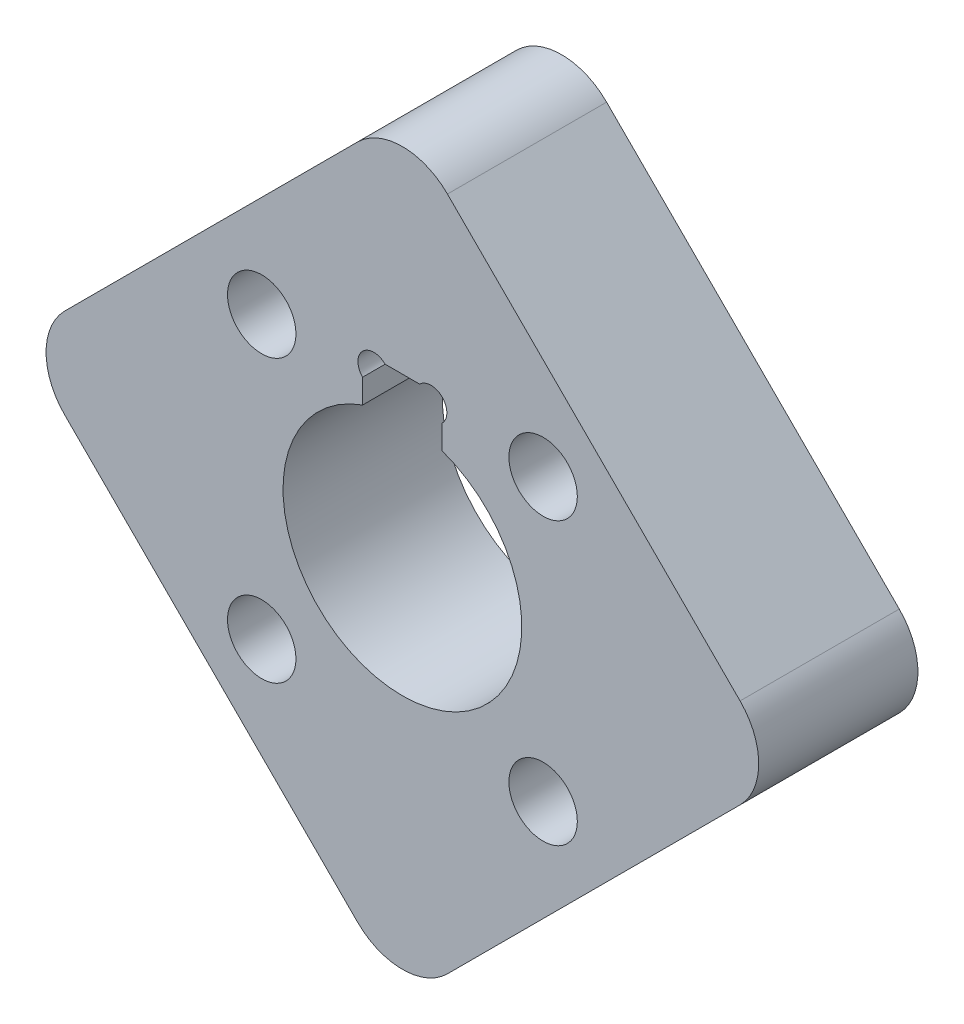
ISO-10303-21;
HEADER;
FILE_DESCRIPTION(('STEP AP214'),'2;1');
FILE_NAME('part.step','',(''),(''),'','','');
FILE_SCHEMA(('AUTOMOTIVE_DESIGN { 1 0 10303 214 1 1 1 1 }'));
ENDSEC;
DATA;
#1=APPLICATION_CONTEXT('core data for automotive mechanical design processes');
#2=APPLICATION_PROTOCOL_DEFINITION('international standard','automotive_design',2000,#1);
#3=PRODUCT_CONTEXT('',#1,'mechanical');
#4=PRODUCT('Part','Part','',(#3));
#5=PRODUCT_RELATED_PRODUCT_CATEGORY('part','',(#4));
#6=PRODUCT_DEFINITION_FORMATION('','',#4);
#7=PRODUCT_DEFINITION_CONTEXT('part definition',#1,'design');
#8=PRODUCT_DEFINITION('design','',#6,#7);
#9=PRODUCT_DEFINITION_SHAPE('','',#8);
#10=(LENGTH_UNIT() NAMED_UNIT(*) SI_UNIT(.MILLI.,.METRE.));
#11=(NAMED_UNIT(*) PLANE_ANGLE_UNIT() SI_UNIT($,.RADIAN.));
#12=(NAMED_UNIT(*) SI_UNIT($,.STERADIAN.) SOLID_ANGLE_UNIT());
#13=UNCERTAINTY_MEASURE_WITH_UNIT(LENGTH_MEASURE(1.E-05),#10,'distance_accuracy_value','');
#14=(GEOMETRIC_REPRESENTATION_CONTEXT(3) GLOBAL_UNCERTAINTY_ASSIGNED_CONTEXT((#13)) GLOBAL_UNIT_ASSIGNED_CONTEXT((#10,
#11,#12)) REPRESENTATION_CONTEXT('',''));
#15=CARTESIAN_POINT('',(0.,0.,0.));
#16=DIRECTION('',(0.,0.,1.));
#17=DIRECTION('',(1.,0.,0.));
#18=AXIS2_PLACEMENT_3D('',#15,#16,#17);
#19=CARTESIAN_POINT('',(0.,18.3847763108502,10.));
#20=DIRECTION('',(0.,0.,-1.));
#21=DIRECTION('',(-1.,0.,0.));
#22=AXIS2_PLACEMENT_3D('',#19,#20,#21);
#23=CYLINDRICAL_SURFACE('',#22,4.);
#24=CARTESIAN_POINT('',(0.,18.3847763108502,0.));
#25=DIRECTION('',(0.,0.,1.));
#26=DIRECTION('',(1.,0.,0.));
#27=AXIS2_PLACEMENT_3D('',#24,#25,#26);
#28=CIRCLE('',#27,4.);
#29=CARTESIAN_POINT('',(-2.82842712474619,21.2132034355964,0.));
#30=VERTEX_POINT('',#29);
#31=CARTESIAN_POINT('',(2.82842712474619,21.2132034355964,0.));
#32=VERTEX_POINT('',#31);
#33=EDGE_CURVE('E215',#30,#32,#28,.F.);
#34=ORIENTED_EDGE('',*,*,#33,.F.);
#35=DIRECTION('',(0.,0.,-1.));
#36=VECTOR('',#35,1.);
#37=CARTESIAN_POINT('',(-2.82842712474619,21.2132034355964,10.));
#38=LINE('',#37,#36);
#39=CARTESIAN_POINT('',(-2.82842712474619,21.2132034355964,10.));
#40=VERTEX_POINT('',#39);
#41=EDGE_CURVE('E11',#40,#30,#38,.T.);
#42=ORIENTED_EDGE('',*,*,#41,.F.);
#43=CARTESIAN_POINT('',(0.,18.3847763108502,10.));
#44=DIRECTION('',(0.,0.,1.));
#45=DIRECTION('',(1.,0.,0.));
#46=AXIS2_PLACEMENT_3D('',#43,#44,#45);
#47=CIRCLE('',#46,4.);
#48=CARTESIAN_POINT('',(2.82842712474619,21.2132034355964,10.));
#49=VERTEX_POINT('',#48);
#50=EDGE_CURVE('E244',#40,#49,#47,.F.);
#51=ORIENTED_EDGE('',*,*,#50,.T.);
#52=DIRECTION('',(0.,0.,-1.));
#53=VECTOR('',#52,1.);
#54=CARTESIAN_POINT('',(2.82842712474619,21.2132034355964,10.));
#55=LINE('',#54,#53);
#56=EDGE_CURVE('E55',#49,#32,#55,.T.);
#57=ORIENTED_EDGE('',*,*,#56,.T.);
#58=EDGE_LOOP('',(#34,#42,#51,#57));
#59=FACE_BOUND('',#58,.T.);
#60=ADVANCED_FACE('F36',(#59),#23,.T.);
#61=CARTESIAN_POINT('',(-12.0208152801713,12.0208152801713,10.));
#62=DIRECTION('',(-0.707106781186547,0.707106781186548,0.));
#63=DIRECTION('',(-0.707106781186548,-0.707106781186547,0.));
#64=AXIS2_PLACEMENT_3D('',#61,#62,#63);
#65=PLANE('',#64);
#66=DIRECTION('',(0.707106781186548,0.707106781186547,0.));
#67=VECTOR('',#66,1.);
#68=CARTESIAN_POINT('',(-12.0208152801713,12.0208152801713,0.));
#69=LINE('',#68,#67);
#70=CARTESIAN_POINT('',(-21.2132034355964,2.82842712474619,0.));
#71=VERTEX_POINT('',#70);
#72=EDGE_CURVE('E212',#71,#30,#69,.T.);
#73=ORIENTED_EDGE('',*,*,#72,.F.);
#74=DIRECTION('',(0.,0.,-1.));
#75=VECTOR('',#74,1.);
#76=CARTESIAN_POINT('',(-21.2132034355964,2.82842712474619,10.));
#77=LINE('',#76,#75);
#78=CARTESIAN_POINT('',(-21.2132034355964,2.82842712474619,10.));
#79=VERTEX_POINT('',#78);
#80=EDGE_CURVE('E46',#79,#71,#77,.T.);
#81=ORIENTED_EDGE('',*,*,#80,.F.);
#82=DIRECTION('',(0.707106781186548,0.707106781186547,0.));
#83=VECTOR('',#82,1.);
#84=CARTESIAN_POINT('',(-12.0208152801713,12.0208152801713,10.));
#85=LINE('',#84,#83);
#86=EDGE_CURVE('E241',#79,#40,#85,.T.);
#87=ORIENTED_EDGE('',*,*,#86,.T.);
#88=ORIENTED_EDGE('',*,*,#41,.T.);
#89=EDGE_LOOP('',(#73,#81,#87,#88));
#90=FACE_BOUND('',#89,.T.);
#91=ADVANCED_FACE('F324',(#90),#65,.T.);
#92=CARTESIAN_POINT('',(-18.3847763108502,0.,10.));
#93=DIRECTION('',(0.,0.,-1.));
#94=DIRECTION('',(-1.,0.,0.));
#95=AXIS2_PLACEMENT_3D('',#92,#93,#94);
#96=CYLINDRICAL_SURFACE('',#95,4.);
#97=CARTESIAN_POINT('',(-18.3847763108502,0.,0.));
#98=DIRECTION('',(0.,0.,1.));
#99=DIRECTION('',(1.,0.,0.));
#100=AXIS2_PLACEMENT_3D('',#97,#98,#99);
#101=CIRCLE('',#100,4.);
#102=CARTESIAN_POINT('',(-21.2132034355964,-2.82842712474619,0.));
#103=VERTEX_POINT('',#102);
#104=EDGE_CURVE('E209',#71,#103,#101,.T.);
#105=ORIENTED_EDGE('',*,*,#104,.T.);
#106=DIRECTION('',(0.,0.,-1.));
#107=VECTOR('',#106,1.);
#108=CARTESIAN_POINT('',(-21.2132034355964,-2.82842712474619,10.));
#109=LINE('',#108,#107);
#110=CARTESIAN_POINT('',(-21.2132034355964,-2.82842712474619,10.));
#111=VERTEX_POINT('',#110);
#112=EDGE_CURVE('E175',#111,#103,#109,.T.);
#113=ORIENTED_EDGE('',*,*,#112,.F.);
#114=CARTESIAN_POINT('',(-18.3847763108502,0.,10.));
#115=DIRECTION('',(0.,0.,1.));
#116=DIRECTION('',(1.,0.,0.));
#117=AXIS2_PLACEMENT_3D('',#114,#115,#116);
#118=CIRCLE('',#117,4.);
#119=EDGE_CURVE('E238',#79,#111,#118,.T.);
#120=ORIENTED_EDGE('',*,*,#119,.F.);
#121=ORIENTED_EDGE('',*,*,#80,.T.);
#122=EDGE_LOOP('',(#105,#113,#120,#121));
#123=FACE_BOUND('',#122,.T.);
#124=ADVANCED_FACE('F329',(#123),#96,.T.);
#125=CARTESIAN_POINT('',(-12.0208152801713,-12.0208152801713,10.));
#126=DIRECTION('',(0.707106781186547,0.707106781186548,0.));
#127=DIRECTION('',(-0.707106781186548,0.707106781186547,0.));
#128=AXIS2_PLACEMENT_3D('',#125,#126,#127);
#129=PLANE('',#128);
#130=DIRECTION('',(0.707106781186548,-0.707106781186547,0.));
#131=VECTOR('',#130,1.);
#132=CARTESIAN_POINT('',(-12.0208152801713,-12.0208152801713,0.));
#133=LINE('',#132,#131);
#134=CARTESIAN_POINT('',(-2.82842712474619,-21.2132034355964,0.));
#135=VERTEX_POINT('',#134);
#136=EDGE_CURVE('E206',#103,#135,#133,.T.);
#137=ORIENTED_EDGE('',*,*,#136,.T.);
#138=DIRECTION('',(0.,0.,-1.));
#139=VECTOR('',#138,1.);
#140=CARTESIAN_POINT('',(-2.82842712474619,-21.2132034355964,10.));
#141=LINE('',#140,#139);
#142=CARTESIAN_POINT('',(-2.82842712474619,-21.2132034355964,10.));
#143=VERTEX_POINT('',#142);
#144=EDGE_CURVE('E168',#143,#135,#141,.T.);
#145=ORIENTED_EDGE('',*,*,#144,.F.);
#146=DIRECTION('',(0.707106781186548,-0.707106781186547,0.));
#147=VECTOR('',#146,1.);
#148=CARTESIAN_POINT('',(-12.0208152801713,-12.0208152801713,10.));
#149=LINE('',#148,#147);
#150=EDGE_CURVE('E236',#111,#143,#149,.T.);
#151=ORIENTED_EDGE('',*,*,#150,.F.);
#152=ORIENTED_EDGE('',*,*,#112,.T.);
#153=EDGE_LOOP('',(#137,#145,#151,#152));
#154=FACE_BOUND('',#153,.T.);
#155=ADVANCED_FACE('F335',(#154),#129,.F.);
#156=CARTESIAN_POINT('',(0.,-18.3847763108502,10.));
#157=DIRECTION('',(0.,0.,-1.));
#158=DIRECTION('',(-1.,0.,0.));
#159=AXIS2_PLACEMENT_3D('',#156,#157,#158);
#160=CYLINDRICAL_SURFACE('',#159,4.);
#161=CARTESIAN_POINT('',(0.,-18.3847763108502,0.));
#162=DIRECTION('',(0.,0.,1.));
#163=DIRECTION('',(1.,0.,0.));
#164=AXIS2_PLACEMENT_3D('',#161,#162,#163);
#165=CIRCLE('',#164,4.);
#166=CARTESIAN_POINT('',(2.82842712474619,-21.2132034355964,0.));
#167=VERTEX_POINT('',#166);
#168=EDGE_CURVE('E203',#135,#167,#165,.T.);
#169=ORIENTED_EDGE('',*,*,#168,.T.);
#170=DIRECTION('',(0.,0.,-1.));
#171=VECTOR('',#170,1.);
#172=CARTESIAN_POINT('',(2.82842712474619,-21.2132034355964,10.));
#173=LINE('',#172,#171);
#174=CARTESIAN_POINT('',(2.82842712474619,-21.2132034355964,10.));
#175=VERTEX_POINT('',#174);
#176=EDGE_CURVE('E166',#175,#167,#173,.T.);
#177=ORIENTED_EDGE('',*,*,#176,.F.);
#178=CARTESIAN_POINT('',(0.,-18.3847763108502,10.));
#179=DIRECTION('',(0.,0.,1.));
#180=DIRECTION('',(1.,0.,0.));
#181=AXIS2_PLACEMENT_3D('',#178,#179,#180);
#182=CIRCLE('',#181,4.);
#183=EDGE_CURVE('E159',#143,#175,#182,.T.);
#184=ORIENTED_EDGE('',*,*,#183,.F.);
#185=ORIENTED_EDGE('',*,*,#144,.T.);
#186=EDGE_LOOP('',(#169,#177,#184,#185));
#187=FACE_BOUND('',#186,.T.);
#188=ADVANCED_FACE('F339',(#187),#160,.T.);
#189=CARTESIAN_POINT('',(12.0208152801713,-12.0208152801713,10.));
#190=DIRECTION('',(-0.707106781186547,0.707106781186548,0.));
#191=DIRECTION('',(-0.707106781186548,-0.707106781186547,0.));
#192=AXIS2_PLACEMENT_3D('',#189,#190,#191);
#193=PLANE('',#192);
#194=DIRECTION('',(0.707106781186548,0.707106781186547,0.));
#195=VECTOR('',#194,1.);
#196=CARTESIAN_POINT('',(12.0208152801713,-12.0208152801713,0.));
#197=LINE('',#196,#195);
#198=CARTESIAN_POINT('',(21.2132034355964,-2.82842712474619,0.));
#199=VERTEX_POINT('',#198);
#200=EDGE_CURVE('E165',#167,#199,#197,.T.);
#201=ORIENTED_EDGE('',*,*,#200,.T.);
#202=DIRECTION('',(0.,0.,-1.));
#203=VECTOR('',#202,1.);
#204=CARTESIAN_POINT('',(21.2132034355964,-2.82842712474619,10.));
#205=LINE('',#204,#203);
#206=CARTESIAN_POINT('',(21.2132034355964,-2.82842712474619,10.));
#207=VERTEX_POINT('',#206);
#208=EDGE_CURVE('E148',#207,#199,#205,.T.);
#209=ORIENTED_EDGE('',*,*,#208,.F.);
#210=DIRECTION('',(0.707106781186548,0.707106781186547,0.));
#211=VECTOR('',#210,1.);
#212=CARTESIAN_POINT('',(12.0208152801713,-12.0208152801713,10.));
#213=LINE('',#212,#211);
#214=EDGE_CURVE('E153',#175,#207,#213,.T.);
#215=ORIENTED_EDGE('',*,*,#214,.F.);
#216=ORIENTED_EDGE('',*,*,#176,.T.);
#217=EDGE_LOOP('',(#201,#209,#215,#216));
#218=FACE_BOUND('',#217,.T.);
#219=ADVANCED_FACE('F164',(#218),#193,.F.);
#220=CARTESIAN_POINT('',(18.3847763108502,0.,10.));
#221=DIRECTION('',(0.,0.,-1.));
#222=DIRECTION('',(-1.,0.,0.));
#223=AXIS2_PLACEMENT_3D('',#220,#221,#222);
#224=CYLINDRICAL_SURFACE('',#223,4.);
#225=CARTESIAN_POINT('',(18.3847763108502,0.,0.));
#226=DIRECTION('',(0.,0.,1.));
#227=DIRECTION('',(1.,0.,0.));
#228=AXIS2_PLACEMENT_3D('',#225,#226,#227);
#229=CIRCLE('',#228,4.);
#230=CARTESIAN_POINT('',(21.2132034355964,2.82842712474619,0.));
#231=VERTEX_POINT('',#230);
#232=EDGE_CURVE('E200',#199,#231,#229,.T.);
#233=ORIENTED_EDGE('',*,*,#232,.T.);
#234=DIRECTION('',(0.,0.,-1.));
#235=VECTOR('',#234,1.);
#236=CARTESIAN_POINT('',(21.2132034355964,2.82842712474619,10.));
#237=LINE('',#236,#235);
#238=CARTESIAN_POINT('',(21.2132034355964,2.82842712474619,10.));
#239=VERTEX_POINT('',#238);
#240=EDGE_CURVE('E99',#239,#231,#237,.T.);
#241=ORIENTED_EDGE('',*,*,#240,.F.);
#242=CARTESIAN_POINT('',(18.3847763108502,0.,10.));
#243=DIRECTION('',(0.,0.,1.));
#244=DIRECTION('',(1.,0.,0.));
#245=AXIS2_PLACEMENT_3D('',#242,#243,#244);
#246=CIRCLE('',#245,4.);
#247=EDGE_CURVE('E144',#207,#239,#246,.T.);
#248=ORIENTED_EDGE('',*,*,#247,.F.);
#249=ORIENTED_EDGE('',*,*,#208,.T.);
#250=EDGE_LOOP('',(#233,#241,#248,#249));
#251=FACE_BOUND('',#250,.T.);
#252=ADVANCED_FACE('F146',(#251),#224,.T.);
#253=CARTESIAN_POINT('',(1.79289321881346,9.29289321881345,10.));
#254=DIRECTION('',(0.,0.,-1.));
#255=DIRECTION('',(-1.,0.,0.));
#256=AXIS2_PLACEMENT_3D('',#253,#254,#255);
#257=CYLINDRICAL_SURFACE('',#256,1.);
#258=CARTESIAN_POINT('',(1.79289321881346,9.29289321881345,0.));
#259=DIRECTION('',(0.,0.,1.));
#260=DIRECTION('',(1.,0.,0.));
#261=AXIS2_PLACEMENT_3D('',#258,#259,#260);
#262=CIRCLE('',#261,1.);
#263=CARTESIAN_POINT('',(2.5,8.5857864376269,0.));
#264=VERTEX_POINT('',#263);
#265=CARTESIAN_POINT('',(1.08578643762691,10.,0.));
#266=VERTEX_POINT('',#265);
#267=EDGE_CURVE('E230',#264,#266,#262,.T.);
#268=ORIENTED_EDGE('',*,*,#267,.F.);
#269=DIRECTION('',(0.,0.,-1.));
#270=VECTOR('',#269,1.);
#271=CARTESIAN_POINT('',(2.5,8.5857864376269,10.));
#272=LINE('',#271,#270);
#273=CARTESIAN_POINT('',(2.5,8.5857864376269,10.));
#274=VERTEX_POINT('',#273);
#275=EDGE_CURVE('E40',#274,#264,#272,.T.);
#276=ORIENTED_EDGE('',*,*,#275,.F.);
#277=CARTESIAN_POINT('',(1.79289321881346,9.29289321881345,10.));
#278=DIRECTION('',(0.,0.,1.));
#279=DIRECTION('',(1.,0.,0.));
#280=AXIS2_PLACEMENT_3D('',#277,#278,#279);
#281=CIRCLE('',#280,1.);
#282=CARTESIAN_POINT('',(1.08578643762691,10.,10.));
#283=VERTEX_POINT('',#282);
#284=EDGE_CURVE('E199',#274,#283,#281,.T.);
#285=ORIENTED_EDGE('',*,*,#284,.T.);
#286=DIRECTION('',(0.,0.,-1.));
#287=VECTOR('',#286,1.);
#288=CARTESIAN_POINT('',(1.08578643762691,10.,10.));
#289=LINE('',#288,#287);
#290=EDGE_CURVE('E179',#283,#266,#289,.T.);
#291=ORIENTED_EDGE('',*,*,#290,.T.);
#292=EDGE_LOOP('',(#268,#276,#285,#291));
#293=FACE_BOUND('',#292,.T.);
#294=ADVANCED_FACE('F38',(#293),#257,.F.);
#295=CARTESIAN_POINT('',(2.5,0.,10.));
#296=DIRECTION('',(1.,0.,0.));
#297=DIRECTION('',(0.,0.,-1.));
#298=AXIS2_PLACEMENT_3D('',#295,#296,#297);
#299=PLANE('',#298);
#300=DIRECTION('',(0.,-1.,0.));
#301=VECTOR('',#300,1.);
#302=CARTESIAN_POINT('',(2.5,0.,0.));
#303=LINE('',#302,#301);
#304=CARTESIAN_POINT('',(2.5,7.07106781186548,0.));
#305=VERTEX_POINT('',#304);
#306=EDGE_CURVE('E228',#264,#305,#303,.T.);
#307=ORIENTED_EDGE('',*,*,#306,.T.);
#308=DIRECTION('',(0.,0.,-1.));
#309=VECTOR('',#308,1.);
#310=CARTESIAN_POINT('',(2.5,7.07106781186548,10.));
#311=LINE('',#310,#309);
#312=CARTESIAN_POINT('',(2.5,7.07106781186548,10.));
#313=VERTEX_POINT('',#312);
#314=EDGE_CURVE('E187',#313,#305,#311,.T.);
#315=ORIENTED_EDGE('',*,*,#314,.F.);
#316=DIRECTION('',(0.,-1.,0.));
#317=VECTOR('',#316,1.);
#318=CARTESIAN_POINT('',(2.5,0.,10.));
#319=LINE('',#318,#317);
#320=EDGE_CURVE('E255',#274,#313,#319,.T.);
#321=ORIENTED_EDGE('',*,*,#320,.F.);
#322=ORIENTED_EDGE('',*,*,#275,.T.);
#323=EDGE_LOOP('',(#307,#315,#321,#322));
#324=FACE_BOUND('',#323,.T.);
#325=ADVANCED_FACE('F306',(#324),#299,.F.);
#326=CARTESIAN_POINT('',(0.,0.,10.));
#327=DIRECTION('',(0.,0.,-1.));
#328=DIRECTION('',(-1.,0.,0.));
#329=AXIS2_PLACEMENT_3D('',#326,#327,#328);
#330=CYLINDRICAL_SURFACE('',#329,7.5);
#331=CARTESIAN_POINT('',(0.,0.,0.));
#332=DIRECTION('',(0.,0.,1.));
#333=DIRECTION('',(1.,0.,0.));
#334=AXIS2_PLACEMENT_3D('',#331,#332,#333);
#335=CIRCLE('',#334,7.5);
#336=CARTESIAN_POINT('',(-2.5,7.07106781186548,0.));
#337=VERTEX_POINT('',#336);
#338=EDGE_CURVE('E225',#337,#305,#335,.T.);
#339=ORIENTED_EDGE('',*,*,#338,.F.);
#340=DIRECTION('',(0.,0.,-1.));
#341=VECTOR('',#340,1.);
#342=CARTESIAN_POINT('',(-2.5,7.07106781186548,10.));
#343=LINE('',#342,#341);
#344=CARTESIAN_POINT('',(-2.5,7.07106781186548,10.));
#345=VERTEX_POINT('',#344);
#346=EDGE_CURVE('E186',#345,#337,#343,.T.);
#347=ORIENTED_EDGE('',*,*,#346,.F.);
#348=CARTESIAN_POINT('',(0.,0.,10.));
#349=DIRECTION('',(0.,0.,1.));
#350=DIRECTION('',(1.,0.,0.));
#351=AXIS2_PLACEMENT_3D('',#348,#349,#350);
#352=CIRCLE('',#351,7.5);
#353=EDGE_CURVE('E253',#345,#313,#352,.T.);
#354=ORIENTED_EDGE('',*,*,#353,.T.);
#355=ORIENTED_EDGE('',*,*,#314,.T.);
#356=EDGE_LOOP('',(#339,#347,#354,#355));
#357=FACE_BOUND('',#356,.T.);
#358=ADVANCED_FACE('F307',(#357),#330,.F.);
#359=CARTESIAN_POINT('',(-2.5,0.,10.));
#360=DIRECTION('',(1.,0.,0.));
#361=DIRECTION('',(0.,1.,0.));
#362=AXIS2_PLACEMENT_3D('',#359,#360,#361);
#363=PLANE('',#362);
#364=DIRECTION('',(0.,-1.,0.));
#365=VECTOR('',#364,1.);
#366=CARTESIAN_POINT('',(-2.5,0.,0.));
#367=LINE('',#366,#365);
#368=CARTESIAN_POINT('',(-2.5,8.5857864376269,0.));
#369=VERTEX_POINT('',#368);
#370=EDGE_CURVE('E222',#369,#337,#367,.T.);
#371=ORIENTED_EDGE('',*,*,#370,.F.);
#372=DIRECTION('',(0.,0.,-1.));
#373=VECTOR('',#372,1.);
#374=CARTESIAN_POINT('',(-2.5,8.5857864376269,10.));
#375=LINE('',#374,#373);
#376=CARTESIAN_POINT('',(-2.5,8.5857864376269,10.));
#377=VERTEX_POINT('',#376);
#378=EDGE_CURVE('E184',#377,#369,#375,.T.);
#379=ORIENTED_EDGE('',*,*,#378,.F.);
#380=DIRECTION('',(0.,-1.,0.));
#381=VECTOR('',#380,1.);
#382=CARTESIAN_POINT('',(-2.5,0.,10.));
#383=LINE('',#382,#381);
#384=EDGE_CURVE('E250',#377,#345,#383,.T.);
#385=ORIENTED_EDGE('',*,*,#384,.T.);
#386=ORIENTED_EDGE('',*,*,#346,.T.);
#387=EDGE_LOOP('',(#371,#379,#385,#386));
#388=FACE_BOUND('',#387,.T.);
#389=ADVANCED_FACE('F311',(#388),#363,.T.);
#390=CARTESIAN_POINT('',(-1.79289321881346,9.29289321881345,10.));
#391=DIRECTION('',(0.,0.,-1.));
#392=DIRECTION('',(-1.,0.,0.));
#393=AXIS2_PLACEMENT_3D('',#390,#391,#392);
#394=CYLINDRICAL_SURFACE('',#393,1.);
#395=CARTESIAN_POINT('',(-1.79289321881346,9.29289321881345,0.));
#396=DIRECTION('',(0.,0.,1.));
#397=DIRECTION('',(1.,0.,0.));
#398=AXIS2_PLACEMENT_3D('',#395,#396,#397);
#399=CIRCLE('',#398,1.);
#400=CARTESIAN_POINT('',(-1.08578643762691,10.,0.));
#401=VERTEX_POINT('',#400);
#402=EDGE_CURVE('E220',#369,#401,#399,.F.);
#403=ORIENTED_EDGE('',*,*,#402,.T.);
#404=DIRECTION('',(0.,0.,-1.));
#405=VECTOR('',#404,1.);
#406=CARTESIAN_POINT('',(-1.08578643762691,10.,10.));
#407=LINE('',#406,#405);
#408=CARTESIAN_POINT('',(-1.08578643762691,10.,10.));
#409=VERTEX_POINT('',#408);
#410=EDGE_CURVE('E181',#409,#401,#407,.T.);
#411=ORIENTED_EDGE('',*,*,#410,.F.);
#412=CARTESIAN_POINT('',(-1.79289321881346,9.29289321881345,10.));
#413=DIRECTION('',(0.,0.,1.));
#414=DIRECTION('',(1.,0.,0.));
#415=AXIS2_PLACEMENT_3D('',#412,#413,#414);
#416=CIRCLE('',#415,1.);
#417=EDGE_CURVE('E248',#377,#409,#416,.F.);
#418=ORIENTED_EDGE('',*,*,#417,.F.);
#419=ORIENTED_EDGE('',*,*,#378,.T.);
#420=EDGE_LOOP('',(#403,#411,#418,#419));
#421=FACE_BOUND('',#420,.T.);
#422=ADVANCED_FACE('F314',(#421),#394,.F.);
#423=CARTESIAN_POINT('',(0.,10.,10.));
#424=DIRECTION('',(0.,1.,0.));
#425=DIRECTION('',(0.,0.,1.));
#426=AXIS2_PLACEMENT_3D('',#423,#424,#425);
#427=PLANE('',#426);
#428=DIRECTION('',(1.,0.,0.));
#429=VECTOR('',#428,1.);
#430=CARTESIAN_POINT('',(0.,10.,0.));
#431=LINE('',#430,#429);
#432=EDGE_CURVE('E217',#401,#266,#431,.T.);
#433=ORIENTED_EDGE('',*,*,#432,.T.);
#434=ORIENTED_EDGE('',*,*,#290,.F.);
#435=DIRECTION('',(1.,0.,0.));
#436=VECTOR('',#435,1.);
#437=CARTESIAN_POINT('',(0.,10.,10.));
#438=LINE('',#437,#436);
#439=EDGE_CURVE('E246',#409,#283,#438,.T.);
#440=ORIENTED_EDGE('',*,*,#439,.F.);
#441=ORIENTED_EDGE('',*,*,#410,.T.);
#442=EDGE_LOOP('',(#433,#434,#440,#441));
#443=FACE_BOUND('',#442,.T.);
#444=ADVANCED_FACE('F301',(#443),#427,.F.);
#445=CARTESIAN_POINT('',(12.0208152801713,12.0208152801713,10.));
#446=DIRECTION('',(0.707106781186547,0.707106781186548,0.));
#447=DIRECTION('',(-0.707106781186548,0.707106781186547,0.));
#448=AXIS2_PLACEMENT_3D('',#445,#446,#447);
#449=PLANE('',#448);
#450=DIRECTION('',(0.707106781186548,-0.707106781186547,0.));
#451=VECTOR('',#450,1.);
#452=CARTESIAN_POINT('',(12.0208152801713,12.0208152801713,0.));
#453=LINE('',#452,#451);
#454=EDGE_CURVE('E196',#32,#231,#453,.T.);
#455=ORIENTED_EDGE('',*,*,#454,.F.);
#456=ORIENTED_EDGE('',*,*,#56,.F.);
#457=DIRECTION('',(0.707106781186548,-0.707106781186547,0.));
#458=VECTOR('',#457,1.);
#459=CARTESIAN_POINT('',(12.0208152801713,12.0208152801713,10.));
#460=LINE('',#459,#458);
#461=EDGE_CURVE('E152',#49,#239,#460,.T.);
#462=ORIENTED_EDGE('',*,*,#461,.T.);
#463=ORIENTED_EDGE('',*,*,#240,.T.);
#464=EDGE_LOOP('',(#455,#456,#462,#463));
#465=FACE_BOUND('',#464,.T.);
#466=ADVANCED_FACE('F287',(#465),#449,.T.);
#467=CARTESIAN_POINT('',(0.,0.,10.));
#468=DIRECTION('',(0.,0.,1.));
#469=DIRECTION('',(1.,0.,0.));
#470=AXIS2_PLACEMENT_3D('',#467,#468,#469);
#471=PLANE('',#470);
#472=CARTESIAN_POINT('',(-8.83883476483184,8.83883476483185,10.));
#473=DIRECTION('',(0.,0.,1.));
#474=DIRECTION('',(1.,0.,0.));
#475=AXIS2_PLACEMENT_3D('',#472,#473,#474);
#476=CIRCLE('',#475,2.15);
#477=CARTESIAN_POINT('',(-6.68883476483184,8.83883476483185,10.));
#478=VERTEX_POINT('',#477);
#479=EDGE_CURVE('E278',#478,#478,#476,.T.);
#480=ORIENTED_EDGE('',*,*,#479,.F.);
#481=EDGE_LOOP('',(#480));
#482=FACE_BOUND('',#481,.T.);
#483=CARTESIAN_POINT('',(8.83883476483184,8.83883476483184,10.));
#484=DIRECTION('',(0.,0.,1.));
#485=DIRECTION('',(1.,0.,0.));
#486=AXIS2_PLACEMENT_3D('',#483,#484,#485);
#487=CIRCLE('',#486,2.15);
#488=CARTESIAN_POINT('',(10.9888347648318,8.83883476483184,10.));
#489=VERTEX_POINT('',#488);
#490=EDGE_CURVE('E272',#489,#489,#487,.T.);
#491=ORIENTED_EDGE('',*,*,#490,.F.);
#492=EDGE_LOOP('',(#491));
#493=FACE_BOUND('',#492,.T.);
#494=CARTESIAN_POINT('',(8.83883476483184,-8.83883476483184,10.));
#495=DIRECTION('',(0.,0.,1.));
#496=DIRECTION('',(1.,0.,0.));
#497=AXIS2_PLACEMENT_3D('',#494,#495,#496);
#498=CIRCLE('',#497,2.15);
#499=CARTESIAN_POINT('',(10.9888347648318,-8.83883476483184,10.));
#500=VERTEX_POINT('',#499);
#501=EDGE_CURVE('E266',#500,#500,#498,.T.);
#502=ORIENTED_EDGE('',*,*,#501,.F.);
#503=EDGE_LOOP('',(#502));
#504=FACE_BOUND('',#503,.T.);
#505=CARTESIAN_POINT('',(-8.83883476483184,-8.83883476483185,10.));
#506=DIRECTION('',(0.,0.,1.));
#507=DIRECTION('',(1.,0.,0.));
#508=AXIS2_PLACEMENT_3D('',#505,#506,#507);
#509=CIRCLE('',#508,2.15);
#510=CARTESIAN_POINT('',(-6.68883476483184,-8.83883476483185,10.));
#511=VERTEX_POINT('',#510);
#512=EDGE_CURVE('E260',#511,#511,#509,.T.);
#513=ORIENTED_EDGE('',*,*,#512,.F.);
#514=EDGE_LOOP('',(#513));
#515=FACE_BOUND('',#514,.T.);
#516=ORIENTED_EDGE('',*,*,#284,.F.);
#517=ORIENTED_EDGE('',*,*,#320,.T.);
#518=ORIENTED_EDGE('',*,*,#353,.F.);
#519=ORIENTED_EDGE('',*,*,#384,.F.);
#520=ORIENTED_EDGE('',*,*,#417,.T.);
#521=ORIENTED_EDGE('',*,*,#439,.T.);
#522=EDGE_LOOP('',(#516,#517,#518,#519,#520,#521));
#523=FACE_BOUND('',#522,.T.);
#524=ORIENTED_EDGE('',*,*,#50,.F.);
#525=ORIENTED_EDGE('',*,*,#86,.F.);
#526=ORIENTED_EDGE('',*,*,#119,.T.);
#527=ORIENTED_EDGE('',*,*,#150,.T.);
#528=ORIENTED_EDGE('',*,*,#183,.T.);
#529=ORIENTED_EDGE('',*,*,#214,.T.);
#530=ORIENTED_EDGE('',*,*,#247,.T.);
#531=ORIENTED_EDGE('',*,*,#461,.F.);
#532=EDGE_LOOP('',(#524,#525,#526,#527,#528,#529,#530,#531));
#533=FACE_BOUND('',#532,.T.);
#534=ADVANCED_FACE('F157',(#482,#493,#504,#515,#523,#533),#471,.T.);
#535=CARTESIAN_POINT('',(0.,0.,0.));
#536=DIRECTION('',(0.,0.,1.));
#537=DIRECTION('',(1.,0.,0.));
#538=AXIS2_PLACEMENT_3D('',#535,#536,#537);
#539=PLANE('',#538);
#540=CARTESIAN_POINT('',(-8.83883476483184,8.83883476483185,0.));
#541=DIRECTION('',(0.,0.,1.));
#542=DIRECTION('',(1.,0.,0.));
#543=AXIS2_PLACEMENT_3D('',#540,#541,#542);
#544=CIRCLE('',#543,2.15);
#545=CARTESIAN_POINT('',(-6.68883476483185,8.83883476483185,0.));
#546=VERTEX_POINT('',#545);
#547=EDGE_CURVE('E275',#546,#546,#544,.T.);
#548=ORIENTED_EDGE('',*,*,#547,.T.);
#549=EDGE_LOOP('',(#548));
#550=FACE_BOUND('',#549,.T.);
#551=CARTESIAN_POINT('',(8.83883476483184,8.83883476483184,0.));
#552=DIRECTION('',(0.,0.,1.));
#553=DIRECTION('',(1.,0.,0.));
#554=AXIS2_PLACEMENT_3D('',#551,#552,#553);
#555=CIRCLE('',#554,2.15);
#556=CARTESIAN_POINT('',(10.9888347648318,8.83883476483184,0.));
#557=VERTEX_POINT('',#556);
#558=EDGE_CURVE('E269',#557,#557,#555,.T.);
#559=ORIENTED_EDGE('',*,*,#558,.T.);
#560=EDGE_LOOP('',(#559));
#561=FACE_BOUND('',#560,.T.);
#562=CARTESIAN_POINT('',(8.83883476483184,-8.83883476483184,0.));
#563=DIRECTION('',(0.,0.,1.));
#564=DIRECTION('',(1.,0.,0.));
#565=AXIS2_PLACEMENT_3D('',#562,#563,#564);
#566=CIRCLE('',#565,2.15);
#567=CARTESIAN_POINT('',(10.9888347648318,-8.83883476483184,0.));
#568=VERTEX_POINT('',#567);
#569=EDGE_CURVE('E263',#568,#568,#566,.T.);
#570=ORIENTED_EDGE('',*,*,#569,.T.);
#571=EDGE_LOOP('',(#570));
#572=FACE_BOUND('',#571,.T.);
#573=CARTESIAN_POINT('',(-8.83883476483184,-8.83883476483185,0.));
#574=DIRECTION('',(0.,0.,1.));
#575=DIRECTION('',(1.,0.,0.));
#576=AXIS2_PLACEMENT_3D('',#573,#574,#575);
#577=CIRCLE('',#576,2.15);
#578=CARTESIAN_POINT('',(-6.68883476483184,-8.83883476483185,0.));
#579=VERTEX_POINT('',#578);
#580=EDGE_CURVE('E233',#579,#579,#577,.T.);
#581=ORIENTED_EDGE('',*,*,#580,.T.);
#582=EDGE_LOOP('',(#581));
#583=FACE_BOUND('',#582,.T.);
#584=ORIENTED_EDGE('',*,*,#267,.T.);
#585=ORIENTED_EDGE('',*,*,#432,.F.);
#586=ORIENTED_EDGE('',*,*,#402,.F.);
#587=ORIENTED_EDGE('',*,*,#370,.T.);
#588=ORIENTED_EDGE('',*,*,#338,.T.);
#589=ORIENTED_EDGE('',*,*,#306,.F.);
#590=EDGE_LOOP('',(#584,#585,#586,#587,#588,#589));
#591=FACE_BOUND('',#590,.T.);
#592=ORIENTED_EDGE('',*,*,#33,.T.);
#593=ORIENTED_EDGE('',*,*,#454,.T.);
#594=ORIENTED_EDGE('',*,*,#232,.F.);
#595=ORIENTED_EDGE('',*,*,#200,.F.);
#596=ORIENTED_EDGE('',*,*,#168,.F.);
#597=ORIENTED_EDGE('',*,*,#136,.F.);
#598=ORIENTED_EDGE('',*,*,#104,.F.);
#599=ORIENTED_EDGE('',*,*,#72,.T.);
#600=EDGE_LOOP('',(#592,#593,#594,#595,#596,#597,#598,#599));
#601=FACE_BOUND('',#600,.T.);
#602=ADVANCED_FACE('F286',(#550,#561,#572,#583,#591,#601),#539,.F.);
#603=CARTESIAN_POINT('',(-8.83883476483184,-8.83883476483185,10.));
#604=DIRECTION('',(0.,0.,1.));
#605=DIRECTION('',(1.,0.,0.));
#606=AXIS2_PLACEMENT_3D('',#603,#604,#605);
#607=CYLINDRICAL_SURFACE('',#606,2.15);
#608=ORIENTED_EDGE('',*,*,#580,.F.);
#609=EDGE_LOOP('',(#608));
#610=FACE_BOUND('',#609,.T.);
#611=ORIENTED_EDGE('',*,*,#512,.T.);
#612=EDGE_LOOP('',(#611));
#613=FACE_BOUND('',#612,.T.);
#614=ADVANCED_FACE('F351',(#610,#613),#607,.F.);
#615=CARTESIAN_POINT('',(8.83883476483184,-8.83883476483184,10.));
#616=DIRECTION('',(0.,0.,1.));
#617=DIRECTION('',(1.,0.,0.));
#618=AXIS2_PLACEMENT_3D('',#615,#616,#617);
#619=CYLINDRICAL_SURFACE('',#618,2.15);
#620=ORIENTED_EDGE('',*,*,#569,.F.);
#621=EDGE_LOOP('',(#620));
#622=FACE_BOUND('',#621,.T.);
#623=ORIENTED_EDGE('',*,*,#501,.T.);
#624=EDGE_LOOP('',(#623));
#625=FACE_BOUND('',#624,.T.);
#626=ADVANCED_FACE('F356',(#622,#625),#619,.F.);
#627=CARTESIAN_POINT('',(8.83883476483184,8.83883476483184,10.));
#628=DIRECTION('',(0.,0.,1.));
#629=DIRECTION('',(1.,0.,0.));
#630=AXIS2_PLACEMENT_3D('',#627,#628,#629);
#631=CYLINDRICAL_SURFACE('',#630,2.15);
#632=ORIENTED_EDGE('',*,*,#558,.F.);
#633=EDGE_LOOP('',(#632));
#634=FACE_BOUND('',#633,.T.);
#635=ORIENTED_EDGE('',*,*,#490,.T.);
#636=EDGE_LOOP('',(#635));
#637=FACE_BOUND('',#636,.T.);
#638=ADVANCED_FACE('F360',(#634,#637),#631,.F.);
#639=CARTESIAN_POINT('',(-8.83883476483184,8.83883476483185,10.));
#640=DIRECTION('',(0.,0.,1.));
#641=DIRECTION('',(1.,0.,0.));
#642=AXIS2_PLACEMENT_3D('',#639,#640,#641);
#643=CYLINDRICAL_SURFACE('',#642,2.15);
#644=ORIENTED_EDGE('',*,*,#547,.F.);
#645=EDGE_LOOP('',(#644));
#646=FACE_BOUND('',#645,.T.);
#647=ORIENTED_EDGE('',*,*,#479,.T.);
#648=EDGE_LOOP('',(#647));
#649=FACE_BOUND('',#648,.T.);
#650=ADVANCED_FACE('F282',(#646,#649),#643,.F.);
#651=CLOSED_SHELL('',(#60,#91,#124,#155,#188,#219,#252,#294,#325,#358,#389,#422,#444,#466,#534,
#602,#614,#626,#638,#650));
#652=MANIFOLD_SOLID_BREP('B2',#651);
#653=ADVANCED_BREP_SHAPE_REPRESENTATION('',(#18,#652),#14);
#654=SHAPE_DEFINITION_REPRESENTATION(#9,#653);
ENDSEC;
END-ISO-10303-21;
